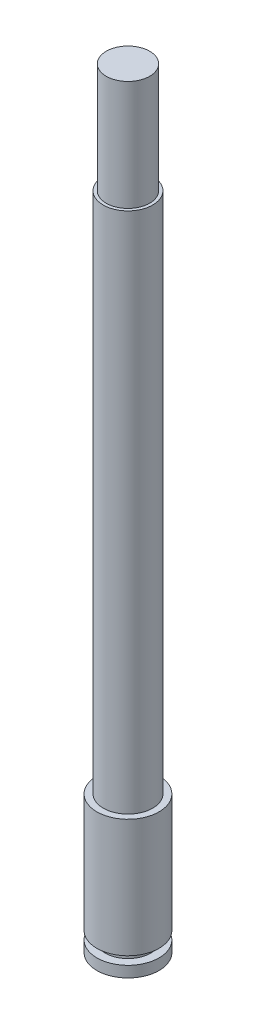
ISO-10303-21;
HEADER;
FILE_DESCRIPTION(('STEP AP214'),'2;1');
FILE_NAME('part.step','',(''),(''),'','','');
FILE_SCHEMA(('AUTOMOTIVE_DESIGN { 1 0 10303 214 1 1 1 1 }'));
ENDSEC;
DATA;
#1=APPLICATION_CONTEXT('core data for automotive mechanical design processes');
#2=APPLICATION_PROTOCOL_DEFINITION('international standard','automotive_design',2000,#1);
#3=PRODUCT_CONTEXT('',#1,'mechanical');
#4=PRODUCT('Part','Part','',(#3));
#5=PRODUCT_RELATED_PRODUCT_CATEGORY('part','',(#4));
#6=PRODUCT_DEFINITION_FORMATION('','',#4);
#7=PRODUCT_DEFINITION_CONTEXT('part definition',#1,'design');
#8=PRODUCT_DEFINITION('design','',#6,#7);
#9=PRODUCT_DEFINITION_SHAPE('','',#8);
#10=(LENGTH_UNIT() NAMED_UNIT(*) SI_UNIT(.MILLI.,.METRE.));
#11=(NAMED_UNIT(*) PLANE_ANGLE_UNIT() SI_UNIT($,.RADIAN.));
#12=(NAMED_UNIT(*) SI_UNIT($,.STERADIAN.) SOLID_ANGLE_UNIT());
#13=UNCERTAINTY_MEASURE_WITH_UNIT(LENGTH_MEASURE(1.E-05),#10,'distance_accuracy_value','');
#14=(GEOMETRIC_REPRESENTATION_CONTEXT(3) GLOBAL_UNCERTAINTY_ASSIGNED_CONTEXT((#13)) GLOBAL_UNIT_ASSIGNED_CONTEXT((#10,
#11,#12)) REPRESENTATION_CONTEXT('',''));
#15=CARTESIAN_POINT('',(0.,0.,0.));
#16=DIRECTION('',(0.,0.,1.));
#17=DIRECTION('',(1.,0.,0.));
#18=AXIS2_PLACEMENT_3D('',#15,#16,#17);
#19=CARTESIAN_POINT('',(0.,120.,0.));
#20=DIRECTION('',(0.,1.,0.));
#21=DIRECTION('',(0.,0.,1.));
#22=AXIS2_PLACEMENT_3D('',#19,#20,#21);
#23=PLANE('',#22);
#24=CARTESIAN_POINT('',(0.,120.,0.));
#25=DIRECTION('',(0.,1.,0.));
#26=DIRECTION('',(0.,0.,1.));
#27=AXIS2_PLACEMENT_3D('',#24,#25,#26);
#28=CIRCLE('',#27,4.5);
#29=CARTESIAN_POINT('',(0.,120.,4.5));
#30=VERTEX_POINT('',#29);
#31=EDGE_CURVE('E58',#30,#30,#28,.T.);
#32=ORIENTED_EDGE('',*,*,#31,.T.);
#33=EDGE_LOOP('',(#32));
#34=FACE_BOUND('',#33,.T.);
#35=CARTESIAN_POINT('',(0.,120.,0.));
#36=DIRECTION('',(0.,1.,0.));
#37=DIRECTION('',(0.,0.,1.));
#38=AXIS2_PLACEMENT_3D('',#35,#36,#37);
#39=CIRCLE('',#38,3.95);
#40=CARTESIAN_POINT('',(0.,120.,3.95));
#41=VERTEX_POINT('',#40);
#42=EDGE_CURVE('E62',#41,#41,#39,.T.);
#43=ORIENTED_EDGE('',*,*,#42,.F.);
#44=EDGE_LOOP('',(#43));
#45=FACE_BOUND('',#44,.T.);
#46=ADVANCED_FACE('F31',(#34,#45),#23,.T.);
#47=CARTESIAN_POINT('',(0.,25.,0.));
#48=DIRECTION('',(0.,1.,0.));
#49=DIRECTION('',(0.,0.,1.));
#50=AXIS2_PLACEMENT_3D('',#47,#48,#49);
#51=PLANE('',#50);
#52=CARTESIAN_POINT('',(0.,25.,0.));
#53=DIRECTION('',(0.,1.,0.));
#54=DIRECTION('',(0.,0.,1.));
#55=AXIS2_PLACEMENT_3D('',#52,#53,#54);
#56=CIRCLE('',#55,5.65);
#57=CARTESIAN_POINT('',(0.,25.,5.65));
#58=VERTEX_POINT('',#57);
#59=EDGE_CURVE('E47',#58,#58,#56,.T.);
#60=ORIENTED_EDGE('',*,*,#59,.T.);
#61=EDGE_LOOP('',(#60));
#62=FACE_BOUND('',#61,.T.);
#63=CARTESIAN_POINT('',(0.,25.,0.));
#64=DIRECTION('',(0.,1.,0.));
#65=DIRECTION('',(0.,0.,1.));
#66=AXIS2_PLACEMENT_3D('',#63,#64,#65);
#67=CIRCLE('',#66,4.5);
#68=CARTESIAN_POINT('',(0.,25.,4.5));
#69=VERTEX_POINT('',#68);
#70=EDGE_CURVE('E53',#69,#69,#67,.T.);
#71=ORIENTED_EDGE('',*,*,#70,.F.);
#72=EDGE_LOOP('',(#71));
#73=FACE_BOUND('',#72,.T.);
#74=ADVANCED_FACE('F78',(#62,#73),#51,.T.);
#75=CARTESIAN_POINT('',(0.,2.,0.));
#76=DIRECTION('',(0.,1.,0.));
#77=DIRECTION('',(0.,0.,1.));
#78=AXIS2_PLACEMENT_3D('',#75,#76,#77);
#79=PLANE('',#78);
#80=CARTESIAN_POINT('',(0.,2.,0.));
#81=DIRECTION('',(0.,1.,0.));
#82=DIRECTION('',(0.,0.,1.));
#83=AXIS2_PLACEMENT_3D('',#80,#81,#82);
#84=CIRCLE('',#83,5.65);
#85=CARTESIAN_POINT('',(0.,2.,5.65));
#86=VERTEX_POINT('',#85);
#87=EDGE_CURVE('E10',#86,#86,#84,.T.);
#88=ORIENTED_EDGE('',*,*,#87,.T.);
#89=EDGE_LOOP('',(#88));
#90=FACE_BOUND('',#89,.T.);
#91=CARTESIAN_POINT('',(0.,2.,0.));
#92=DIRECTION('',(0.,1.,0.));
#93=DIRECTION('',(0.,0.,1.));
#94=AXIS2_PLACEMENT_3D('',#91,#92,#93);
#95=CIRCLE('',#94,4.15);
#96=CARTESIAN_POINT('',(0.,2.,4.15));
#97=VERTEX_POINT('',#96);
#98=EDGE_CURVE('E44',#97,#97,#95,.T.);
#99=ORIENTED_EDGE('',*,*,#98,.F.);
#100=EDGE_LOOP('',(#99));
#101=FACE_BOUND('',#100,.T.);
#102=ADVANCED_FACE('F84',(#90,#101),#79,.T.);
#103=CARTESIAN_POINT('',(0.,2.,0.));
#104=DIRECTION('',(0.,-1.,0.));
#105=DIRECTION('',(0.,0.,-1.));
#106=AXIS2_PLACEMENT_3D('',#103,#104,#105);
#107=CYLINDRICAL_SURFACE('',#106,5.65);
#108=ORIENTED_EDGE('',*,*,#87,.F.);
#109=EDGE_LOOP('',(#108));
#110=FACE_BOUND('',#109,.T.);
#111=CARTESIAN_POINT('',(0.,0.,0.));
#112=DIRECTION('',(0.,1.,0.));
#113=DIRECTION('',(0.,0.,1.));
#114=AXIS2_PLACEMENT_3D('',#111,#112,#113);
#115=CIRCLE('',#114,5.65);
#116=CARTESIAN_POINT('',(0.,0.,5.65));
#117=VERTEX_POINT('',#116);
#118=EDGE_CURVE('E35',#117,#117,#115,.T.);
#119=ORIENTED_EDGE('',*,*,#118,.T.);
#120=EDGE_LOOP('',(#119));
#121=FACE_BOUND('',#120,.T.);
#122=ADVANCED_FACE('F33',(#110,#121),#107,.T.);
#123=CARTESIAN_POINT('',(0.,0.,0.));
#124=DIRECTION('',(0.,1.,0.));
#125=DIRECTION('',(0.,0.,1.));
#126=AXIS2_PLACEMENT_3D('',#123,#124,#125);
#127=PLANE('',#126);
#128=ORIENTED_EDGE('',*,*,#118,.F.);
#129=EDGE_LOOP('',(#128));
#130=FACE_BOUND('',#129,.T.);
#131=ADVANCED_FACE('F103',(#130),#127,.F.);
#132=CARTESIAN_POINT('',(0.,3.5,0.));
#133=DIRECTION('',(0.,-1.,0.));
#134=DIRECTION('',(0.,0.,-1.));
#135=AXIS2_PLACEMENT_3D('',#132,#133,#134);
#136=CYLINDRICAL_SURFACE('',#135,4.15);
#137=CARTESIAN_POINT('',(0.,3.5,0.));
#138=DIRECTION('',(0.,1.,0.));
#139=DIRECTION('',(0.,0.,1.));
#140=AXIS2_PLACEMENT_3D('',#137,#138,#139);
#141=CIRCLE('',#140,4.15);
#142=CARTESIAN_POINT('',(0.,3.5,4.15));
#143=VERTEX_POINT('',#142);
#144=EDGE_CURVE('E42',#143,#143,#141,.T.);
#145=ORIENTED_EDGE('',*,*,#144,.F.);
#146=EDGE_LOOP('',(#145));
#147=FACE_BOUND('',#146,.T.);
#148=ORIENTED_EDGE('',*,*,#98,.T.);
#149=EDGE_LOOP('',(#148));
#150=FACE_BOUND('',#149,.T.);
#151=ADVANCED_FACE('F96',(#147,#150),#136,.T.);
#152=CARTESIAN_POINT('',(0.,3.5,0.));
#153=DIRECTION('',(0.,1.,0.));
#154=DIRECTION('',(0.,0.,1.));
#155=AXIS2_PLACEMENT_3D('',#152,#153,#154);
#156=PLANE('',#155);
#157=CARTESIAN_POINT('',(0.,3.5,0.));
#158=DIRECTION('',(0.,1.,0.));
#159=DIRECTION('',(0.,0.,1.));
#160=AXIS2_PLACEMENT_3D('',#157,#158,#159);
#161=CIRCLE('',#160,5.65);
#162=CARTESIAN_POINT('',(0.,3.5,5.65));
#163=VERTEX_POINT('',#162);
#164=EDGE_CURVE('E50',#163,#163,#161,.T.);
#165=ORIENTED_EDGE('',*,*,#164,.F.);
#166=EDGE_LOOP('',(#165));
#167=FACE_BOUND('',#166,.T.);
#168=ORIENTED_EDGE('',*,*,#144,.T.);
#169=EDGE_LOOP('',(#168));
#170=FACE_BOUND('',#169,.T.);
#171=ADVANCED_FACE('F93',(#167,#170),#156,.F.);
#172=CARTESIAN_POINT('',(0.,25.,0.));
#173=DIRECTION('',(0.,-1.,0.));
#174=DIRECTION('',(0.,0.,-1.));
#175=AXIS2_PLACEMENT_3D('',#172,#173,#174);
#176=CYLINDRICAL_SURFACE('',#175,5.65);
#177=ORIENTED_EDGE('',*,*,#59,.F.);
#178=EDGE_LOOP('',(#177));
#179=FACE_BOUND('',#178,.T.);
#180=ORIENTED_EDGE('',*,*,#164,.T.);
#181=EDGE_LOOP('',(#180));
#182=FACE_BOUND('',#181,.T.);
#183=ADVANCED_FACE('F90',(#179,#182),#176,.T.);
#184=CARTESIAN_POINT('',(0.,55.,0.));
#185=DIRECTION('',(0.,-1.,0.));
#186=DIRECTION('',(0.,0.,-1.));
#187=AXIS2_PLACEMENT_3D('',#184,#185,#186);
#188=CYLINDRICAL_SURFACE('',#187,4.5);
#189=ORIENTED_EDGE('',*,*,#70,.T.);
#190=EDGE_LOOP('',(#189));
#191=FACE_BOUND('',#190,.T.);
#192=ORIENTED_EDGE('',*,*,#31,.F.);
#193=EDGE_LOOP('',(#192));
#194=FACE_BOUND('',#193,.T.);
#195=ADVANCED_FACE('F73',(#191,#194),#188,.T.);
#196=CARTESIAN_POINT('',(0.,140.,0.));
#197=DIRECTION('',(0.,-1.,0.));
#198=DIRECTION('',(0.,0.,-1.));
#199=AXIS2_PLACEMENT_3D('',#196,#197,#198);
#200=CYLINDRICAL_SURFACE('',#199,3.95);
#201=CARTESIAN_POINT('',(0.,140.,0.));
#202=DIRECTION('',(0.,1.,0.));
#203=DIRECTION('',(0.,0.,1.));
#204=AXIS2_PLACEMENT_3D('',#201,#202,#203);
#205=CIRCLE('',#204,3.95);
#206=CARTESIAN_POINT('',(0.,140.,3.95));
#207=VERTEX_POINT('',#206);
#208=EDGE_CURVE('E61',#207,#207,#205,.T.);
#209=ORIENTED_EDGE('',*,*,#208,.F.);
#210=EDGE_LOOP('',(#209));
#211=FACE_BOUND('',#210,.T.);
#212=ORIENTED_EDGE('',*,*,#42,.T.);
#213=EDGE_LOOP('',(#212));
#214=FACE_BOUND('',#213,.T.);
#215=ADVANCED_FACE('F70',(#211,#214),#200,.T.);
#216=CARTESIAN_POINT('',(0.,140.,0.));
#217=DIRECTION('',(0.,1.,0.));
#218=DIRECTION('',(0.,0.,1.));
#219=AXIS2_PLACEMENT_3D('',#216,#217,#218);
#220=PLANE('',#219);
#221=ORIENTED_EDGE('',*,*,#208,.T.);
#222=EDGE_LOOP('',(#221));
#223=FACE_BOUND('',#222,.T.);
#224=ADVANCED_FACE('F68',(#223),#220,.T.);
#225=CLOSED_SHELL('',(#46,#74,#102,#122,#131,#151,#171,#183,#195,#215,#224));
#226=MANIFOLD_SOLID_BREP('B2',#225);
#227=ADVANCED_BREP_SHAPE_REPRESENTATION('',(#18,#226),#14);
#228=SHAPE_DEFINITION_REPRESENTATION(#9,#227);
ENDSEC;
END-ISO-10303-21;
